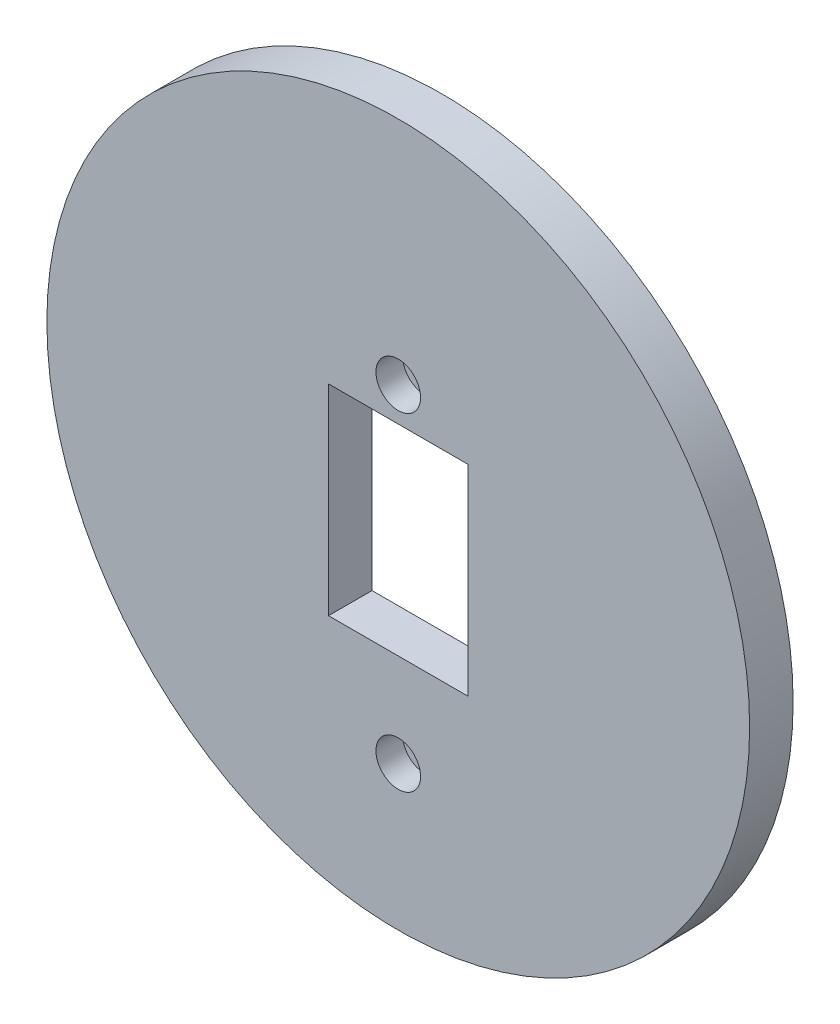
ISO-10303-21;
HEADER;
FILE_DESCRIPTION(('STEP AP214'),'2;1');
FILE_NAME('part.step','',(''),(''),'','','');
FILE_SCHEMA(('AUTOMOTIVE_DESIGN { 1 0 10303 214 1 1 1 1 }'));
ENDSEC;
DATA;
#1=APPLICATION_CONTEXT('core data for automotive mechanical design processes');
#2=APPLICATION_PROTOCOL_DEFINITION('international standard','automotive_design',2000,#1);
#3=PRODUCT_CONTEXT('',#1,'mechanical');
#4=PRODUCT('Part','Part','',(#3));
#5=PRODUCT_RELATED_PRODUCT_CATEGORY('part','',(#4));
#6=PRODUCT_DEFINITION_FORMATION('','',#4);
#7=PRODUCT_DEFINITION_CONTEXT('part definition',#1,'design');
#8=PRODUCT_DEFINITION('design','',#6,#7);
#9=PRODUCT_DEFINITION_SHAPE('','',#8);
#10=(LENGTH_UNIT() NAMED_UNIT(*) SI_UNIT(.MILLI.,.METRE.));
#11=(NAMED_UNIT(*) PLANE_ANGLE_UNIT() SI_UNIT($,.RADIAN.));
#12=(NAMED_UNIT(*) SI_UNIT($,.STERADIAN.) SOLID_ANGLE_UNIT());
#13=UNCERTAINTY_MEASURE_WITH_UNIT(LENGTH_MEASURE(1.E-05),#10,'distance_accuracy_value','');
#14=(GEOMETRIC_REPRESENTATION_CONTEXT(3) GLOBAL_UNCERTAINTY_ASSIGNED_CONTEXT((#13)) GLOBAL_UNIT_ASSIGNED_CONTEXT((#10,
#11,#12)) REPRESENTATION_CONTEXT('',''));
#15=CARTESIAN_POINT('',(0.,0.,0.));
#16=DIRECTION('',(0.,0.,1.));
#17=DIRECTION('',(1.,0.,0.));
#18=AXIS2_PLACEMENT_3D('',#15,#16,#17);
#19=CARTESIAN_POINT('',(-57.4856719225406,22.5865890189122,24.9));
#20=DIRECTION('',(1.,0.,0.));
#21=DIRECTION('',(0.,0.,-1.));
#22=AXIS2_PLACEMENT_3D('',#19,#20,#21);
#23=PLANE('',#22);
#24=DIRECTION('',(0.,0.,-1.));
#25=VECTOR('',#24,1.);
#26=CARTESIAN_POINT('',(-57.4856719225406,-0.413410981087757,28.8));
#27=LINE('',#26,#25);
#28=CARTESIAN_POINT('',(-57.4856719225406,-0.413410981087757,28.8));
#29=VERTEX_POINT('',#28);
#30=CARTESIAN_POINT('',(-57.4856719225406,-0.413410981087757,24.9));
#31=VERTEX_POINT('',#30);
#32=EDGE_CURVE('E80',#29,#31,#27,.T.);
#33=ORIENTED_EDGE('',*,*,#32,.T.);
#34=DIRECTION('',(0.,1.,0.));
#35=VECTOR('',#34,1.);
#36=CARTESIAN_POINT('',(-57.4856719225406,22.5865890189122,24.9));
#37=LINE('',#36,#35);
#38=CARTESIAN_POINT('',(-57.4856719225406,17.5865890189122,24.9));
#39=VERTEX_POINT('',#38);
#40=EDGE_CURVE('E76',#31,#39,#37,.T.);
#41=ORIENTED_EDGE('',*,*,#40,.T.);
#42=DIRECTION('',(0.,0.,-1.));
#43=VECTOR('',#42,1.);
#44=CARTESIAN_POINT('',(-57.4856719225406,17.5865890189122,28.8));
#45=LINE('',#44,#43);
#46=CARTESIAN_POINT('',(-57.4856719225406,17.5865890189122,28.8));
#47=VERTEX_POINT('',#46);
#48=EDGE_CURVE('E77',#47,#39,#45,.T.);
#49=ORIENTED_EDGE('',*,*,#48,.F.);
#50=DIRECTION('',(0.,-1.,0.));
#51=VECTOR('',#50,1.);
#52=CARTESIAN_POINT('',(-57.4856719225406,17.5865890189122,28.8));
#53=LINE('',#52,#51);
#54=EDGE_CURVE('E93',#47,#29,#53,.T.);
#55=ORIENTED_EDGE('',*,*,#54,.T.);
#56=EDGE_LOOP('',(#33,#41,#49,#55));
#57=FACE_BOUND('',#56,.T.);
#58=ADVANCED_FACE('F33',(#57),#23,.T.);
#59=CARTESIAN_POINT('',(-44.9856719225406,22.5865890189122,24.9));
#60=DIRECTION('',(-1.,0.,0.));
#61=DIRECTION('',(0.,0.,1.));
#62=AXIS2_PLACEMENT_3D('',#59,#60,#61);
#63=PLANE('',#62);
#64=DIRECTION('',(0.,0.,-1.));
#65=VECTOR('',#64,1.);
#66=CARTESIAN_POINT('',(-44.9856719225406,17.5865890189122,28.8));
#67=LINE('',#66,#65);
#68=CARTESIAN_POINT('',(-44.9856719225406,17.5865890189122,28.8));
#69=VERTEX_POINT('',#68);
#70=CARTESIAN_POINT('',(-44.9856719225406,17.5865890189122,24.9));
#71=VERTEX_POINT('',#70);
#72=EDGE_CURVE('E50',#69,#71,#67,.T.);
#73=ORIENTED_EDGE('',*,*,#72,.T.);
#74=DIRECTION('',(0.,-1.,0.));
#75=VECTOR('',#74,1.);
#76=CARTESIAN_POINT('',(-44.9856719225406,22.5865890189122,24.9));
#77=LINE('',#76,#75);
#78=CARTESIAN_POINT('',(-44.9856719225406,-0.413410981087756,24.9));
#79=VERTEX_POINT('',#78);
#80=EDGE_CURVE('E86',#71,#79,#77,.T.);
#81=ORIENTED_EDGE('',*,*,#80,.T.);
#82=DIRECTION('',(0.,0.,-1.));
#83=VECTOR('',#82,1.);
#84=CARTESIAN_POINT('',(-44.9856719225406,-0.413410981087757,28.8));
#85=LINE('',#84,#83);
#86=CARTESIAN_POINT('',(-44.9856719225406,-0.413410981087757,28.8));
#87=VERTEX_POINT('',#86);
#88=EDGE_CURVE('E103',#87,#79,#85,.T.);
#89=ORIENTED_EDGE('',*,*,#88,.F.);
#90=DIRECTION('',(0.,1.,0.));
#91=VECTOR('',#90,1.);
#92=CARTESIAN_POINT('',(-44.9856719225406,17.5865890189122,28.8));
#93=LINE('',#92,#91);
#94=EDGE_CURVE('E134',#87,#69,#93,.T.);
#95=ORIENTED_EDGE('',*,*,#94,.T.);
#96=EDGE_LOOP('',(#73,#81,#89,#95));
#97=FACE_BOUND('',#96,.T.);
#98=ADVANCED_FACE('F35',(#97),#63,.T.);
#99=CARTESIAN_POINT('',(-51.2356719225406,-8.41341098108776,28.8));
#100=DIRECTION('',(0.,0.,-1.));
#101=DIRECTION('',(-1.,0.,0.));
#102=AXIS2_PLACEMENT_3D('',#99,#100,#101);
#103=CYLINDRICAL_SURFACE('',#102,0.999999999999998);
#104=CARTESIAN_POINT('',(-51.2356719225406,-8.41341098108776,24.9));
#105=DIRECTION('',(0.,0.,1.));
#106=DIRECTION('',(1.,0.,0.));
#107=AXIS2_PLACEMENT_3D('',#104,#105,#106);
#108=CIRCLE('',#107,0.999999999999998);
#109=CARTESIAN_POINT('',(-50.2356719225406,-8.41341098108776,24.9));
#110=VERTEX_POINT('',#109);
#111=EDGE_CURVE('E109',#110,#110,#108,.F.);
#112=ORIENTED_EDGE('',*,*,#111,.T.);
#113=EDGE_LOOP('',(#112));
#114=FACE_BOUND('',#113,.T.);
#115=CARTESIAN_POINT('',(-51.2356719225406,-8.41341098108776,26.4));
#116=DIRECTION('',(0.,0.,1.));
#117=DIRECTION('',(1.,0.,0.));
#118=AXIS2_PLACEMENT_3D('',#115,#116,#117);
#119=CIRCLE('',#118,0.999999999999998);
#120=CARTESIAN_POINT('',(-50.2356719225406,-8.41341098108776,26.4));
#121=VERTEX_POINT('',#120);
#122=EDGE_CURVE('E37',#121,#121,#119,.T.);
#123=ORIENTED_EDGE('',*,*,#122,.T.);
#124=EDGE_LOOP('',(#123));
#125=FACE_BOUND('',#124,.T.);
#126=ADVANCED_FACE('F159',(#114,#125),#103,.F.);
#127=CARTESIAN_POINT('',(-51.2356719225406,20.6365890189122,28.8));
#128=DIRECTION('',(0.,0.,-1.));
#129=DIRECTION('',(-1.,0.,0.));
#130=AXIS2_PLACEMENT_3D('',#127,#128,#129);
#131=CYLINDRICAL_SURFACE('',#130,0.999999999999998);
#132=CARTESIAN_POINT('',(-51.2356719225406,20.6365890189122,24.9));
#133=DIRECTION('',(0.,0.,1.));
#134=DIRECTION('',(1.,0.,0.));
#135=AXIS2_PLACEMENT_3D('',#132,#133,#134);
#136=CIRCLE('',#135,0.999999999999998);
#137=CARTESIAN_POINT('',(-50.2356719225406,20.6365890189122,24.9));
#138=VERTEX_POINT('',#137);
#139=EDGE_CURVE('E98',#138,#138,#136,.F.);
#140=ORIENTED_EDGE('',*,*,#139,.T.);
#141=EDGE_LOOP('',(#140));
#142=FACE_BOUND('',#141,.T.);
#143=CARTESIAN_POINT('',(-51.2356719225406,20.6365890189122,26.4));
#144=DIRECTION('',(0.,0.,1.));
#145=DIRECTION('',(1.,0.,0.));
#146=AXIS2_PLACEMENT_3D('',#143,#144,#145);
#147=CIRCLE('',#146,0.999999999999998);
#148=CARTESIAN_POINT('',(-50.2356719225406,20.6365890189122,26.4));
#149=VERTEX_POINT('',#148);
#150=EDGE_CURVE('E111',#149,#149,#147,.T.);
#151=ORIENTED_EDGE('',*,*,#150,.T.);
#152=EDGE_LOOP('',(#151));
#153=FACE_BOUND('',#152,.T.);
#154=ADVANCED_FACE('F162',(#142,#153),#131,.F.);
#155=CARTESIAN_POINT('',(-51.2356719225406,9.78658901891225,24.9));
#156=DIRECTION('',(0.,0.,1.));
#157=DIRECTION('',(1.,0.,0.));
#158=AXIS2_PLACEMENT_3D('',#155,#156,#157);
#159=PLANE('',#158);
#160=DIRECTION('',(-1.,0.,0.));
#161=VECTOR('',#160,1.);
#162=CARTESIAN_POINT('',(-57.4856719225406,17.5865890189122,24.9));
#163=LINE('',#162,#161);
#164=EDGE_CURVE('E89',#71,#39,#163,.T.);
#165=ORIENTED_EDGE('',*,*,#164,.T.);
#166=ORIENTED_EDGE('',*,*,#40,.F.);
#167=DIRECTION('',(1.,0.,0.));
#168=VECTOR('',#167,1.);
#169=CARTESIAN_POINT('',(-57.4856719225406,-0.413410981087757,24.9));
#170=LINE('',#169,#168);
#171=EDGE_CURVE('E94',#31,#79,#170,.T.);
#172=ORIENTED_EDGE('',*,*,#171,.T.);
#173=ORIENTED_EDGE('',*,*,#80,.F.);
#174=EDGE_LOOP('',(#165,#166,#172,#173));
#175=FACE_BOUND('',#174,.T.);
#176=CARTESIAN_POINT('',(-51.2356719225406,9.78658901891225,24.9));
#177=DIRECTION('',(0.,0.,1.));
#178=DIRECTION('',(1.,0.,0.));
#179=AXIS2_PLACEMENT_3D('',#176,#177,#178);
#180=CIRCLE('',#179,31.5);
#181=CARTESIAN_POINT('',(-19.7356719225406,9.78658901891225,24.9));
#182=VERTEX_POINT('',#181);
#183=EDGE_CURVE('E42',#182,#182,#180,.T.);
#184=ORIENTED_EDGE('',*,*,#183,.F.);
#185=EDGE_LOOP('',(#184));
#186=FACE_BOUND('',#185,.T.);
#187=ORIENTED_EDGE('',*,*,#139,.F.);
#188=EDGE_LOOP('',(#187));
#189=FACE_BOUND('',#188,.T.);
#190=ORIENTED_EDGE('',*,*,#111,.F.);
#191=EDGE_LOOP('',(#190));
#192=FACE_BOUND('',#191,.T.);
#193=ADVANCED_FACE('F91',(#175,#186,#189,#192),#159,.F.);
#194=CARTESIAN_POINT('',(-51.2356719225406,9.78658901891225,28.8));
#195=DIRECTION('',(0.,0.,1.));
#196=DIRECTION('',(1.,0.,0.));
#197=AXIS2_PLACEMENT_3D('',#194,#195,#196);
#198=PLANE('',#197);
#199=CARTESIAN_POINT('',(-51.2356719225406,20.6365890189122,28.8));
#200=DIRECTION('',(0.,0.,1.));
#201=DIRECTION('',(1.,0.,0.));
#202=AXIS2_PLACEMENT_3D('',#199,#200,#201);
#203=CIRCLE('',#202,2.);
#204=CARTESIAN_POINT('',(-49.2356719225406,20.6365890189122,28.8));
#205=VERTEX_POINT('',#204);
#206=EDGE_CURVE('E118',#205,#205,#203,.T.);
#207=ORIENTED_EDGE('',*,*,#206,.F.);
#208=EDGE_LOOP('',(#207));
#209=FACE_BOUND('',#208,.T.);
#210=CARTESIAN_POINT('',(-51.2356719225406,-8.77116078675755,28.8));
#211=DIRECTION('',(0.,0.,1.));
#212=DIRECTION('',(1.,0.,0.));
#213=AXIS2_PLACEMENT_3D('',#210,#211,#212);
#214=CIRCLE('',#213,2.);
#215=CARTESIAN_POINT('',(-49.2356719225406,-8.77116078675755,28.8));
#216=VERTEX_POINT('',#215);
#217=EDGE_CURVE('E85',#216,#216,#214,.T.);
#218=ORIENTED_EDGE('',*,*,#217,.F.);
#219=EDGE_LOOP('',(#218));
#220=FACE_BOUND('',#219,.T.);
#221=CARTESIAN_POINT('',(-51.2356719225406,9.78658901891225,28.8));
#222=DIRECTION('',(0.,0.,1.));
#223=DIRECTION('',(1.,0.,0.));
#224=AXIS2_PLACEMENT_3D('',#221,#222,#223);
#225=CIRCLE('',#224,31.5);
#226=CARTESIAN_POINT('',(-19.7356719225406,9.78658901891225,28.8));
#227=VERTEX_POINT('',#226);
#228=EDGE_CURVE('E11',#227,#227,#225,.T.);
#229=ORIENTED_EDGE('',*,*,#228,.T.);
#230=EDGE_LOOP('',(#229));
#231=FACE_BOUND('',#230,.T.);
#232=DIRECTION('',(1.,0.,0.));
#233=VECTOR('',#232,1.);
#234=CARTESIAN_POINT('',(-57.4856719225406,-0.413410981087757,28.8));
#235=LINE('',#234,#233);
#236=EDGE_CURVE('E96',#29,#87,#235,.T.);
#237=ORIENTED_EDGE('',*,*,#236,.F.);
#238=ORIENTED_EDGE('',*,*,#54,.F.);
#239=DIRECTION('',(-1.,0.,0.));
#240=VECTOR('',#239,1.);
#241=CARTESIAN_POINT('',(-57.4856719225406,17.5865890189122,28.8));
#242=LINE('',#241,#240);
#243=EDGE_CURVE('E55',#69,#47,#242,.T.);
#244=ORIENTED_EDGE('',*,*,#243,.F.);
#245=ORIENTED_EDGE('',*,*,#94,.F.);
#246=EDGE_LOOP('',(#237,#238,#244,#245));
#247=FACE_BOUND('',#246,.T.);
#248=ADVANCED_FACE('F140',(#209,#220,#231,#247),#198,.T.);
#249=CARTESIAN_POINT('',(-51.2356719225406,9.78658901891225,28.8));
#250=DIRECTION('',(0.,0.,-1.));
#251=DIRECTION('',(-1.,0.,0.));
#252=AXIS2_PLACEMENT_3D('',#249,#250,#251);
#253=CYLINDRICAL_SURFACE('',#252,31.5);
#254=ORIENTED_EDGE('',*,*,#228,.F.);
#255=EDGE_LOOP('',(#254));
#256=FACE_BOUND('',#255,.T.);
#257=ORIENTED_EDGE('',*,*,#183,.T.);
#258=EDGE_LOOP('',(#257));
#259=FACE_BOUND('',#258,.T.);
#260=ADVANCED_FACE('F144',(#256,#259),#253,.T.);
#261=CARTESIAN_POINT('',(-57.4856719225406,-0.413410981087757,28.8));
#262=DIRECTION('',(0.,1.,0.));
#263=DIRECTION('',(0.,0.,1.));
#264=AXIS2_PLACEMENT_3D('',#261,#262,#263);
#265=PLANE('',#264);
#266=ORIENTED_EDGE('',*,*,#171,.F.);
#267=ORIENTED_EDGE('',*,*,#32,.F.);
#268=ORIENTED_EDGE('',*,*,#236,.T.);
#269=ORIENTED_EDGE('',*,*,#88,.T.);
#270=EDGE_LOOP('',(#266,#267,#268,#269));
#271=FACE_BOUND('',#270,.T.);
#272=ADVANCED_FACE('F142',(#271),#265,.T.);
#273=CARTESIAN_POINT('',(-57.4856719225406,17.5865890189122,28.8));
#274=DIRECTION('',(0.,-1.,0.));
#275=DIRECTION('',(0.,0.,-1.));
#276=AXIS2_PLACEMENT_3D('',#273,#274,#275);
#277=PLANE('',#276);
#278=ORIENTED_EDGE('',*,*,#164,.F.);
#279=ORIENTED_EDGE('',*,*,#72,.F.);
#280=ORIENTED_EDGE('',*,*,#243,.T.);
#281=ORIENTED_EDGE('',*,*,#48,.T.);
#282=EDGE_LOOP('',(#278,#279,#280,#281));
#283=FACE_BOUND('',#282,.T.);
#284=ADVANCED_FACE('F88',(#283),#277,.T.);
#285=CARTESIAN_POINT('',(-51.2356719225406,20.6365890189122,26.4));
#286=DIRECTION('',(0.,0.,1.));
#287=DIRECTION('',(1.,0.,0.));
#288=AXIS2_PLACEMENT_3D('',#285,#286,#287);
#289=CYLINDRICAL_SURFACE('',#288,2.);
#290=CARTESIAN_POINT('',(-51.2356719225406,20.6365890189122,26.4));
#291=DIRECTION('',(0.,0.,1.));
#292=DIRECTION('',(1.,0.,0.));
#293=AXIS2_PLACEMENT_3D('',#290,#291,#292);
#294=CIRCLE('',#293,2.);
#295=CARTESIAN_POINT('',(-49.2356719225406,20.6365890189122,26.4));
#296=VERTEX_POINT('',#295);
#297=EDGE_CURVE('E113',#296,#296,#294,.T.);
#298=ORIENTED_EDGE('',*,*,#297,.F.);
#299=EDGE_LOOP('',(#298));
#300=FACE_BOUND('',#299,.T.);
#301=ORIENTED_EDGE('',*,*,#206,.T.);
#302=EDGE_LOOP('',(#301));
#303=FACE_BOUND('',#302,.T.);
#304=ADVANCED_FACE('F150',(#300,#303),#289,.F.);
#305=CARTESIAN_POINT('',(-51.2356719225406,20.6365890189122,26.4));
#306=DIRECTION('',(0.,0.,1.));
#307=DIRECTION('',(1.,0.,0.));
#308=AXIS2_PLACEMENT_3D('',#305,#306,#307);
#309=PLANE('',#308);
#310=ORIENTED_EDGE('',*,*,#150,.F.);
#311=EDGE_LOOP('',(#310));
#312=FACE_BOUND('',#311,.T.);
#313=ORIENTED_EDGE('',*,*,#297,.T.);
#314=EDGE_LOOP('',(#313));
#315=FACE_BOUND('',#314,.T.);
#316=ADVANCED_FACE('F193',(#312,#315),#309,.T.);
#317=CARTESIAN_POINT('',(-51.2356719225406,-8.77116078675755,26.4));
#318=DIRECTION('',(0.,0.,1.));
#319=DIRECTION('',(1.,0.,0.));
#320=AXIS2_PLACEMENT_3D('',#317,#318,#319);
#321=CYLINDRICAL_SURFACE('',#320,2.);
#322=CARTESIAN_POINT('',(-51.2356719225406,-8.77116078675755,26.4));
#323=DIRECTION('',(0.,0.,1.));
#324=DIRECTION('',(1.,0.,0.));
#325=AXIS2_PLACEMENT_3D('',#322,#323,#324);
#326=CIRCLE('',#325,2.);
#327=CARTESIAN_POINT('',(-49.2356719225406,-8.77116078675755,26.4));
#328=VERTEX_POINT('',#327);
#329=EDGE_CURVE('E123',#328,#328,#326,.T.);
#330=ORIENTED_EDGE('',*,*,#329,.F.);
#331=EDGE_LOOP('',(#330));
#332=FACE_BOUND('',#331,.T.);
#333=ORIENTED_EDGE('',*,*,#217,.T.);
#334=EDGE_LOOP('',(#333));
#335=FACE_BOUND('',#334,.T.);
#336=ADVANCED_FACE('F187',(#332,#335),#321,.F.);
#337=CARTESIAN_POINT('',(-51.2356719225406,-8.77116078675755,26.4));
#338=DIRECTION('',(0.,0.,1.));
#339=DIRECTION('',(1.,0.,0.));
#340=AXIS2_PLACEMENT_3D('',#337,#338,#339);
#341=PLANE('',#340);
#342=ORIENTED_EDGE('',*,*,#122,.F.);
#343=EDGE_LOOP('',(#342));
#344=FACE_BOUND('',#343,.T.);
#345=ORIENTED_EDGE('',*,*,#329,.T.);
#346=EDGE_LOOP('',(#345));
#347=FACE_BOUND('',#346,.T.);
#348=ADVANCED_FACE('F184',(#344,#347),#341,.T.);
#349=CLOSED_SHELL('',(#58,#98,#126,#154,#193,#248,#260,#272,#284,#304,#316,#336,#348));
#350=MANIFOLD_SOLID_BREP('B2',#349);
#351=ADVANCED_BREP_SHAPE_REPRESENTATION('',(#18,#350),#14);
#352=SHAPE_DEFINITION_REPRESENTATION(#9,#351);
ENDSEC;
END-ISO-10303-21;
